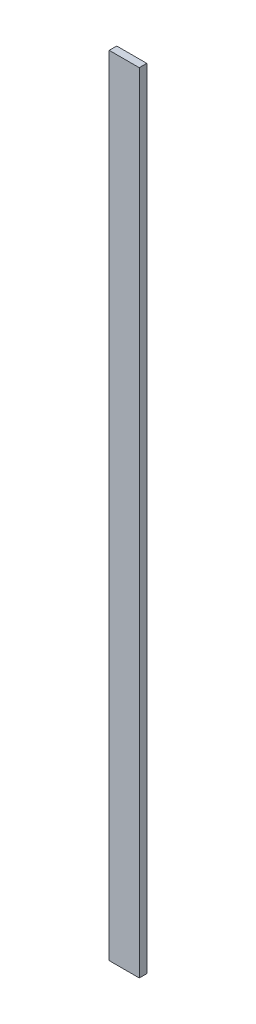
ISO-10303-21;
HEADER;
FILE_DESCRIPTION(('STEP AP214'),'2;1');
FILE_NAME('part.step','',(''),(''),'','','');
FILE_SCHEMA(('AUTOMOTIVE_DESIGN { 1 0 10303 214 1 1 1 1 }'));
ENDSEC;
DATA;
#1=APPLICATION_CONTEXT('core data for automotive mechanical design processes');
#2=APPLICATION_PROTOCOL_DEFINITION('international standard','automotive_design',2000,#1);
#3=PRODUCT_CONTEXT('',#1,'mechanical');
#4=PRODUCT('Part','Part','',(#3));
#5=PRODUCT_RELATED_PRODUCT_CATEGORY('part','',(#4));
#6=PRODUCT_DEFINITION_FORMATION('','',#4);
#7=PRODUCT_DEFINITION_CONTEXT('part definition',#1,'design');
#8=PRODUCT_DEFINITION('design','',#6,#7);
#9=PRODUCT_DEFINITION_SHAPE('','',#8);
#10=(LENGTH_UNIT() NAMED_UNIT(*) SI_UNIT(.MILLI.,.METRE.));
#11=(NAMED_UNIT(*) PLANE_ANGLE_UNIT() SI_UNIT($,.RADIAN.));
#12=(NAMED_UNIT(*) SI_UNIT($,.STERADIAN.) SOLID_ANGLE_UNIT());
#13=UNCERTAINTY_MEASURE_WITH_UNIT(LENGTH_MEASURE(1.E-05),#10,'distance_accuracy_value','');
#14=(GEOMETRIC_REPRESENTATION_CONTEXT(3) GLOBAL_UNCERTAINTY_ASSIGNED_CONTEXT((#13)) GLOBAL_UNIT_ASSIGNED_CONTEXT((#10,
#11,#12)) REPRESENTATION_CONTEXT('',''));
#15=CARTESIAN_POINT('',(0.,0.,0.));
#16=DIRECTION('',(0.,0.,1.));
#17=DIRECTION('',(1.,0.,0.));
#18=AXIS2_PLACEMENT_3D('',#15,#16,#17);
#19=CARTESIAN_POINT('',(6.,157.5,3.));
#20=DIRECTION('',(0.,-1.,0.));
#21=DIRECTION('',(0.,0.,-1.));
#22=AXIS2_PLACEMENT_3D('',#19,#20,#21);
#23=PLANE('',#22);
#24=DIRECTION('',(-1.,0.,0.));
#25=VECTOR('',#24,1.);
#26=CARTESIAN_POINT('',(6.,157.5,0.));
#27=LINE('',#26,#25);
#28=CARTESIAN_POINT('',(6.,157.5,0.));
#29=VERTEX_POINT('',#28);
#30=CARTESIAN_POINT('',(-6.,157.5,0.));
#31=VERTEX_POINT('',#30);
#32=EDGE_CURVE('E113',#29,#31,#27,.T.);
#33=ORIENTED_EDGE('',*,*,#32,.T.);
#34=DIRECTION('',(0.,0.,-1.));
#35=VECTOR('',#34,1.);
#36=CARTESIAN_POINT('',(-6.,157.5,3.));
#37=LINE('',#36,#35);
#38=CARTESIAN_POINT('',(-6.,157.5,3.));
#39=VERTEX_POINT('',#38);
#40=EDGE_CURVE('E11',#39,#31,#37,.T.);
#41=ORIENTED_EDGE('',*,*,#40,.F.);
#42=DIRECTION('',(-1.,0.,0.));
#43=VECTOR('',#42,1.);
#44=CARTESIAN_POINT('',(6.,157.5,3.));
#45=LINE('',#44,#43);
#46=CARTESIAN_POINT('',(6.,157.5,3.));
#47=VERTEX_POINT('',#46);
#48=EDGE_CURVE('E97',#47,#39,#45,.T.);
#49=ORIENTED_EDGE('',*,*,#48,.F.);
#50=DIRECTION('',(0.,0.,-1.));
#51=VECTOR('',#50,1.);
#52=CARTESIAN_POINT('',(6.,157.5,3.));
#53=LINE('',#52,#51);
#54=EDGE_CURVE('E109',#47,#29,#53,.T.);
#55=ORIENTED_EDGE('',*,*,#54,.T.);
#56=EDGE_LOOP('',(#33,#41,#49,#55));
#57=FACE_BOUND('',#56,.T.);
#58=ADVANCED_FACE('F45',(#57),#23,.F.);
#59=CARTESIAN_POINT('',(-6.,-157.5,3.));
#60=DIRECTION('',(1.,0.,0.));
#61=DIRECTION('',(0.,0.,-1.));
#62=AXIS2_PLACEMENT_3D('',#59,#60,#61);
#63=PLANE('',#62);
#64=DIRECTION('',(0.,-1.,0.));
#65=VECTOR('',#64,1.);
#66=CARTESIAN_POINT('',(-6.,-157.5,0.));
#67=LINE('',#66,#65);
#68=CARTESIAN_POINT('',(-6.,-157.5,0.));
#69=VERTEX_POINT('',#68);
#70=EDGE_CURVE('E102',#31,#69,#67,.T.);
#71=ORIENTED_EDGE('',*,*,#70,.T.);
#72=DIRECTION('',(0.,0.,-1.));
#73=VECTOR('',#72,1.);
#74=CARTESIAN_POINT('',(-6.,-157.5,3.));
#75=LINE('',#74,#73);
#76=CARTESIAN_POINT('',(-6.,-157.5,3.));
#77=VERTEX_POINT('',#76);
#78=EDGE_CURVE('E54',#77,#69,#75,.T.);
#79=ORIENTED_EDGE('',*,*,#78,.F.);
#80=DIRECTION('',(0.,-1.,0.));
#81=VECTOR('',#80,1.);
#82=CARTESIAN_POINT('',(-6.,-157.5,3.));
#83=LINE('',#82,#81);
#84=EDGE_CURVE('E92',#39,#77,#83,.T.);
#85=ORIENTED_EDGE('',*,*,#84,.F.);
#86=ORIENTED_EDGE('',*,*,#40,.T.);
#87=EDGE_LOOP('',(#71,#79,#85,#86));
#88=FACE_BOUND('',#87,.T.);
#89=ADVANCED_FACE('F101',(#88),#63,.F.);
#90=CARTESIAN_POINT('',(6.,-157.5,3.));
#91=DIRECTION('',(0.,1.,0.));
#92=DIRECTION('',(0.,0.,1.));
#93=AXIS2_PLACEMENT_3D('',#90,#91,#92);
#94=PLANE('',#93);
#95=DIRECTION('',(1.,0.,0.));
#96=VECTOR('',#95,1.);
#97=CARTESIAN_POINT('',(6.,-157.5,0.));
#98=LINE('',#97,#96);
#99=CARTESIAN_POINT('',(6.,-157.5,0.));
#100=VERTEX_POINT('',#99);
#101=EDGE_CURVE('E79',#69,#100,#98,.T.);
#102=ORIENTED_EDGE('',*,*,#101,.T.);
#103=DIRECTION('',(0.,0.,-1.));
#104=VECTOR('',#103,1.);
#105=CARTESIAN_POINT('',(6.,-157.5,3.));
#106=LINE('',#105,#104);
#107=CARTESIAN_POINT('',(6.,-157.5,3.));
#108=VERTEX_POINT('',#107);
#109=EDGE_CURVE('E104',#108,#100,#106,.T.);
#110=ORIENTED_EDGE('',*,*,#109,.F.);
#111=DIRECTION('',(1.,0.,0.));
#112=VECTOR('',#111,1.);
#113=CARTESIAN_POINT('',(6.,-157.5,3.));
#114=LINE('',#113,#112);
#115=EDGE_CURVE('E95',#77,#108,#114,.T.);
#116=ORIENTED_EDGE('',*,*,#115,.F.);
#117=ORIENTED_EDGE('',*,*,#78,.T.);
#118=EDGE_LOOP('',(#102,#110,#116,#117));
#119=FACE_BOUND('',#118,.T.);
#120=ADVANCED_FACE('F105',(#119),#94,.F.);
#121=CARTESIAN_POINT('',(6.,-157.5,3.));
#122=DIRECTION('',(-1.,0.,0.));
#123=DIRECTION('',(0.,0.,1.));
#124=AXIS2_PLACEMENT_3D('',#121,#122,#123);
#125=PLANE('',#124);
#126=DIRECTION('',(0.,1.,0.));
#127=VECTOR('',#126,1.);
#128=CARTESIAN_POINT('',(6.,-157.5,0.));
#129=LINE('',#128,#127);
#130=EDGE_CURVE('E85',#100,#29,#129,.T.);
#131=ORIENTED_EDGE('',*,*,#130,.T.);
#132=ORIENTED_EDGE('',*,*,#54,.F.);
#133=DIRECTION('',(0.,1.,0.));
#134=VECTOR('',#133,1.);
#135=CARTESIAN_POINT('',(6.,-157.5,3.));
#136=LINE('',#135,#134);
#137=EDGE_CURVE('E62',#108,#47,#136,.T.);
#138=ORIENTED_EDGE('',*,*,#137,.F.);
#139=ORIENTED_EDGE('',*,*,#109,.T.);
#140=EDGE_LOOP('',(#131,#132,#138,#139));
#141=FACE_BOUND('',#140,.T.);
#142=ADVANCED_FACE('F126',(#141),#125,.F.);
#143=CARTESIAN_POINT('',(0.,0.,3.));
#144=DIRECTION('',(0.,0.,-1.));
#145=DIRECTION('',(-1.,0.,0.));
#146=AXIS2_PLACEMENT_3D('',#143,#144,#145);
#147=PLANE('',#146);
#148=ORIENTED_EDGE('',*,*,#48,.T.);
#149=ORIENTED_EDGE('',*,*,#84,.T.);
#150=ORIENTED_EDGE('',*,*,#115,.T.);
#151=ORIENTED_EDGE('',*,*,#137,.T.);
#152=EDGE_LOOP('',(#148,#149,#150,#151));
#153=FACE_BOUND('',#152,.T.);
#154=ADVANCED_FACE('F93',(#153),#147,.F.);
#155=CARTESIAN_POINT('',(0.,0.,0.));
#156=DIRECTION('',(0.,0.,-1.));
#157=DIRECTION('',(-1.,0.,0.));
#158=AXIS2_PLACEMENT_3D('',#155,#156,#157);
#159=PLANE('',#158);
#160=ORIENTED_EDGE('',*,*,#32,.F.);
#161=ORIENTED_EDGE('',*,*,#130,.F.);
#162=ORIENTED_EDGE('',*,*,#101,.F.);
#163=ORIENTED_EDGE('',*,*,#70,.F.);
#164=EDGE_LOOP('',(#160,#161,#162,#163));
#165=FACE_BOUND('',#164,.T.);
#166=ADVANCED_FACE('F129',(#165),#159,.T.);
#167=CLOSED_SHELL('',(#58,#89,#120,#142,#154,#166));
#168=MANIFOLD_SOLID_BREP('B2',#167);
#169=ADVANCED_BREP_SHAPE_REPRESENTATION('',(#18,#168),#14);
#170=SHAPE_DEFINITION_REPRESENTATION(#9,#169);
ENDSEC;
END-ISO-10303-21;
